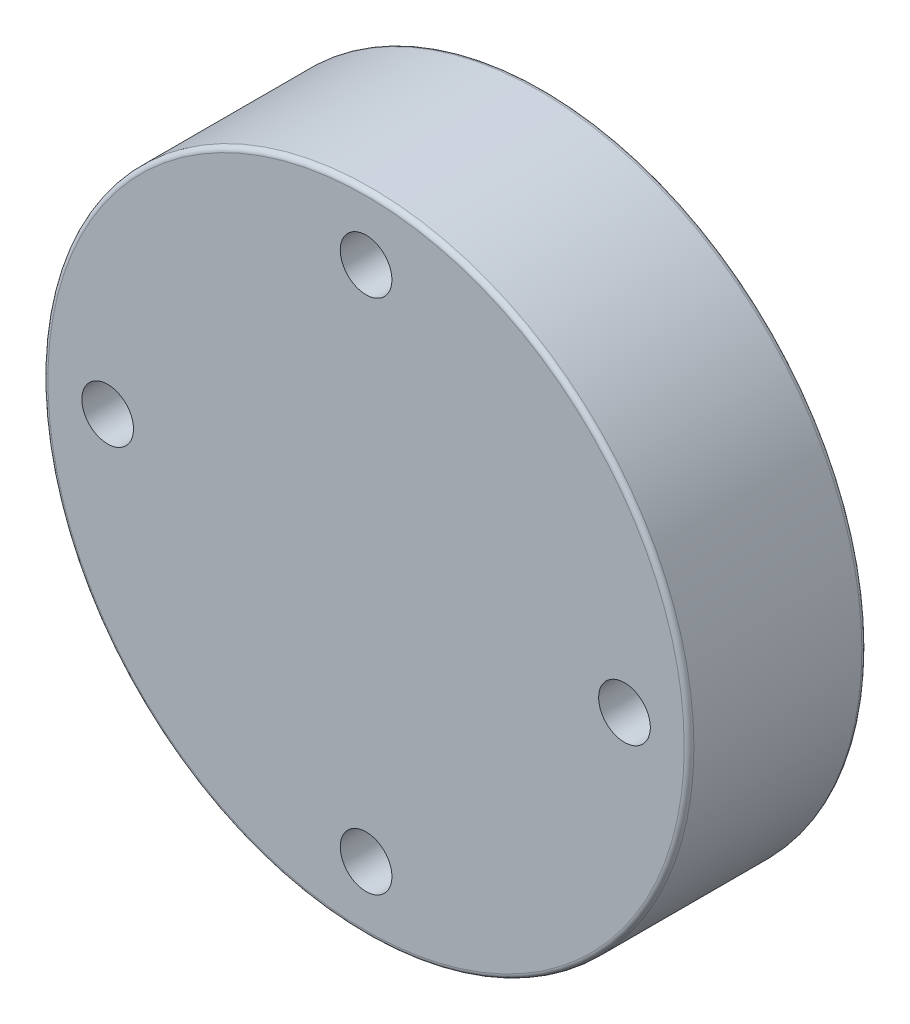
ISO-10303-21;
HEADER;
FILE_DESCRIPTION(('STEP AP214'),'2;1');
FILE_NAME('part.step','',(''),(''),'','','');
FILE_SCHEMA(('AUTOMOTIVE_DESIGN { 1 0 10303 214 1 1 1 1 }'));
ENDSEC;
DATA;
#1=APPLICATION_CONTEXT('core data for automotive mechanical design processes');
#2=APPLICATION_PROTOCOL_DEFINITION('international standard','automotive_design',2000,#1);
#3=PRODUCT_CONTEXT('',#1,'mechanical');
#4=PRODUCT('Part','Part','',(#3));
#5=PRODUCT_RELATED_PRODUCT_CATEGORY('part','',(#4));
#6=PRODUCT_DEFINITION_FORMATION('','',#4);
#7=PRODUCT_DEFINITION_CONTEXT('part definition',#1,'design');
#8=PRODUCT_DEFINITION('design','',#6,#7);
#9=PRODUCT_DEFINITION_SHAPE('','',#8);
#10=(LENGTH_UNIT() NAMED_UNIT(*) SI_UNIT(.MILLI.,.METRE.));
#11=(NAMED_UNIT(*) PLANE_ANGLE_UNIT() SI_UNIT($,.RADIAN.));
#12=(NAMED_UNIT(*) SI_UNIT($,.STERADIAN.) SOLID_ANGLE_UNIT());
#13=UNCERTAINTY_MEASURE_WITH_UNIT(LENGTH_MEASURE(1.E-05),#10,'distance_accuracy_value','');
#14=(GEOMETRIC_REPRESENTATION_CONTEXT(3) GLOBAL_UNCERTAINTY_ASSIGNED_CONTEXT((#13)) GLOBAL_UNIT_ASSIGNED_CONTEXT((#10,
#11,#12)) REPRESENTATION_CONTEXT('',''));
#15=CARTESIAN_POINT('',(0.,0.,0.));
#16=DIRECTION('',(0.,0.,1.));
#17=DIRECTION('',(1.,0.,0.));
#18=AXIS2_PLACEMENT_3D('',#15,#16,#17);
#19=CARTESIAN_POINT('',(0.,0.,10.));
#20=DIRECTION('',(0.,0.,-1.));
#21=DIRECTION('',(0.,-1.,0.));
#22=AXIS2_PLACEMENT_3D('',#19,#20,#21);
#23=PLANE('',#22);
#24=CARTESIAN_POINT('',(0.,0.,10.));
#25=DIRECTION('',(0.,0.,-1.));
#26=DIRECTION('',(-1.,0.,0.));
#27=AXIS2_PLACEMENT_3D('',#24,#25,#26);
#28=CIRCLE('',#27,12.);
#29=CARTESIAN_POINT('',(-12.,0.,10.));
#30=VERTEX_POINT('',#29);
#31=EDGE_CURVE('E126',#30,#30,#28,.T.);
#32=ORIENTED_EDGE('',*,*,#31,.T.);
#33=EDGE_LOOP('',(#32));
#34=FACE_BOUND('',#33,.T.);
#35=ADVANCED_FACE('F16',(#34),#23,.T.);
#36=CARTESIAN_POINT('',(0.,0.,-1.));
#37=DIRECTION('',(0.,0.,1.));
#38=DIRECTION('',(1.,0.,0.));
#39=AXIS2_PLACEMENT_3D('',#36,#37,#38);
#40=CONICAL_SURFACE('',#39,12.5,0.785398163397446);
#41=CARTESIAN_POINT('',(0.,0.,-1.));
#42=DIRECTION('',(0.,0.,-1.));
#43=DIRECTION('',(-1.,0.,0.));
#44=AXIS2_PLACEMENT_3D('',#41,#42,#43);
#45=CIRCLE('',#44,12.5);
#46=CARTESIAN_POINT('',(-12.5,0.,-1.));
#47=VERTEX_POINT('',#46);
#48=EDGE_CURVE('E11',#47,#47,#45,.T.);
#49=ORIENTED_EDGE('',*,*,#48,.F.);
#50=EDGE_LOOP('',(#49));
#51=FACE_BOUND('',#50,.T.);
#52=CARTESIAN_POINT('',(0.,0.,0.));
#53=DIRECTION('',(0.,0.,-1.));
#54=DIRECTION('',(-1.,0.,0.));
#55=AXIS2_PLACEMENT_3D('',#52,#53,#54);
#56=CIRCLE('',#55,13.5);
#57=CARTESIAN_POINT('',(-13.5,0.,0.));
#58=VERTEX_POINT('',#57);
#59=EDGE_CURVE('E82',#58,#58,#56,.T.);
#60=ORIENTED_EDGE('',*,*,#59,.T.);
#61=EDGE_LOOP('',(#60));
#62=FACE_BOUND('',#61,.T.);
#63=ADVANCED_FACE('F223',(#51,#62),#40,.T.);
#64=CARTESIAN_POINT('',(0.,0.,-1.));
#65=DIRECTION('',(0.,0.,-1.));
#66=DIRECTION('',(0.,-1.,0.));
#67=AXIS2_PLACEMENT_3D('',#64,#65,#66);
#68=PLANE('',#67);
#69=CARTESIAN_POINT('',(0.,0.,-1.));
#70=DIRECTION('',(0.,0.,-1.));
#71=DIRECTION('',(-1.,0.,0.));
#72=AXIS2_PLACEMENT_3D('',#69,#70,#71);
#73=CIRCLE('',#72,12.);
#74=CARTESIAN_POINT('',(-12.,0.,-1.));
#75=VERTEX_POINT('',#74);
#76=EDGE_CURVE('E27',#75,#75,#73,.T.);
#77=ORIENTED_EDGE('',*,*,#76,.F.);
#78=EDGE_LOOP('',(#77));
#79=FACE_BOUND('',#78,.T.);
#80=ORIENTED_EDGE('',*,*,#48,.T.);
#81=EDGE_LOOP('',(#80));
#82=FACE_BOUND('',#81,.T.);
#83=ADVANCED_FACE('F227',(#79,#82),#68,.T.);
#84=CARTESIAN_POINT('',(0.,0.,0.3));
#85=DIRECTION('',(0.,0.,1.));
#86=DIRECTION('',(1.,0.,0.));
#87=AXIS2_PLACEMENT_3D('',#84,#85,#86);
#88=TOROIDAL_SURFACE('',#87,19.7,0.3);
#89=CARTESIAN_POINT('',(0.,0.,0.3));
#90=DIRECTION('',(0.,0.,1.));
#91=DIRECTION('',(1.,0.,0.));
#92=AXIS2_PLACEMENT_3D('',#89,#90,#91);
#93=CIRCLE('',#92,20.);
#94=CARTESIAN_POINT('',(20.,0.,0.3));
#95=VERTEX_POINT('',#94);
#96=EDGE_CURVE('E144',#95,#95,#93,.T.);
#97=ORIENTED_EDGE('',*,*,#96,.F.);
#98=EDGE_LOOP('',(#97));
#99=FACE_BOUND('',#98,.T.);
#100=CARTESIAN_POINT('',(0.,0.,0.));
#101=DIRECTION('',(0.,0.,-1.));
#102=DIRECTION('',(1.,0.,0.));
#103=AXIS2_PLACEMENT_3D('',#100,#101,#102);
#104=CIRCLE('',#103,19.7);
#105=CARTESIAN_POINT('',(19.7,0.,0.));
#106=VERTEX_POINT('',#105);
#107=EDGE_CURVE('E89',#106,#106,#104,.T.);
#108=ORIENTED_EDGE('',*,*,#107,.F.);
#109=EDGE_LOOP('',(#108));
#110=FACE_BOUND('',#109,.T.);
#111=ADVANCED_FACE('F230',(#99,#110),#88,.T.);
#112=CARTESIAN_POINT('',(0.,0.,10.7));
#113=DIRECTION('',(0.,0.,1.));
#114=DIRECTION('',(1.,0.,0.));
#115=AXIS2_PLACEMENT_3D('',#112,#113,#114);
#116=TOROIDAL_SURFACE('',#115,19.7,0.3);
#117=CARTESIAN_POINT('',(0.,0.,11.));
#118=DIRECTION('',(0.,0.,1.));
#119=DIRECTION('',(1.,0.,0.));
#120=AXIS2_PLACEMENT_3D('',#117,#118,#119);
#121=CIRCLE('',#120,19.7);
#122=CARTESIAN_POINT('',(19.7,0.,11.));
#123=VERTEX_POINT('',#122);
#124=EDGE_CURVE('E130',#123,#123,#121,.T.);
#125=ORIENTED_EDGE('',*,*,#124,.F.);
#126=EDGE_LOOP('',(#125));
#127=FACE_BOUND('',#126,.T.);
#128=CARTESIAN_POINT('',(0.,0.,10.7));
#129=DIRECTION('',(0.,0.,-1.));
#130=DIRECTION('',(1.,0.,0.));
#131=AXIS2_PLACEMENT_3D('',#128,#129,#130);
#132=CIRCLE('',#131,20.);
#133=CARTESIAN_POINT('',(20.,0.,10.7));
#134=VERTEX_POINT('',#133);
#135=EDGE_CURVE('E147',#134,#134,#132,.T.);
#136=ORIENTED_EDGE('',*,*,#135,.F.);
#137=EDGE_LOOP('',(#136));
#138=FACE_BOUND('',#137,.T.);
#139=ADVANCED_FACE('F232',(#127,#138),#116,.T.);
#140=CARTESIAN_POINT('',(0.,16.,5.));
#141=DIRECTION('',(0.,0.,-1.));
#142=DIRECTION('',(-1.,0.,0.));
#143=AXIS2_PLACEMENT_3D('',#140,#141,#142);
#144=CYLINDRICAL_SURFACE('',#143,1.6);
#145=CARTESIAN_POINT('',(0.,16.,0.));
#146=DIRECTION('',(0.,0.,-1.));
#147=DIRECTION('',(-1.,0.,0.));
#148=AXIS2_PLACEMENT_3D('',#145,#146,#147);
#149=CIRCLE('',#148,1.6);
#150=CARTESIAN_POINT('',(-1.6,16.,0.));
#151=VERTEX_POINT('',#150);
#152=EDGE_CURVE('E108',#151,#151,#149,.T.);
#153=ORIENTED_EDGE('',*,*,#152,.T.);
#154=EDGE_LOOP('',(#153));
#155=FACE_BOUND('',#154,.T.);
#156=CARTESIAN_POINT('',(0.,16.,11.));
#157=DIRECTION('',(0.,0.,-1.));
#158=DIRECTION('',(-1.,0.,0.));
#159=AXIS2_PLACEMENT_3D('',#156,#157,#158);
#160=CIRCLE('',#159,1.6);
#161=CARTESIAN_POINT('',(-1.6,16.,11.));
#162=VERTEX_POINT('',#161);
#163=EDGE_CURVE('E127',#162,#162,#160,.T.);
#164=ORIENTED_EDGE('',*,*,#163,.F.);
#165=EDGE_LOOP('',(#164));
#166=FACE_BOUND('',#165,.T.);
#167=ADVANCED_FACE('F248',(#155,#166),#144,.F.);
#168=CARTESIAN_POINT('',(-16.,4.49068668875334E-13,5.));
#169=DIRECTION('',(0.,0.,-1.));
#170=DIRECTION('',(-1.,0.,0.));
#171=AXIS2_PLACEMENT_3D('',#168,#169,#170);
#172=CYLINDRICAL_SURFACE('',#171,1.60000000000048);
#173=CARTESIAN_POINT('',(-16.,4.49068668875334E-13,0.));
#174=DIRECTION('',(0.,0.,-1.));
#175=DIRECTION('',(-1.,0.,0.));
#176=AXIS2_PLACEMENT_3D('',#173,#174,#175);
#177=CIRCLE('',#176,1.60000000000048);
#178=CARTESIAN_POINT('',(-17.6000000000005,4.49068668875334E-13,0.));
#179=VERTEX_POINT('',#178);
#180=EDGE_CURVE('E102',#179,#179,#177,.T.);
#181=ORIENTED_EDGE('',*,*,#180,.T.);
#182=EDGE_LOOP('',(#181));
#183=FACE_BOUND('',#182,.T.);
#184=CARTESIAN_POINT('',(-16.,4.49068668875334E-13,11.));
#185=DIRECTION('',(0.,0.,-1.));
#186=DIRECTION('',(-1.,0.,0.));
#187=AXIS2_PLACEMENT_3D('',#184,#185,#186);
#188=CIRCLE('',#187,1.60000000000048);
#189=CARTESIAN_POINT('',(-17.6000000000005,4.49068668875334E-13,11.));
#190=VERTEX_POINT('',#189);
#191=EDGE_CURVE('E129',#190,#190,#188,.T.);
#192=ORIENTED_EDGE('',*,*,#191,.F.);
#193=EDGE_LOOP('',(#192));
#194=FACE_BOUND('',#193,.T.);
#195=ADVANCED_FACE('F103',(#183,#194),#172,.F.);
#196=CARTESIAN_POINT('',(-4.58483142604494E-13,-15.9999999999995,5.));
#197=DIRECTION('',(0.,0.,-1.));
#198=DIRECTION('',(-1.,0.,0.));
#199=AXIS2_PLACEMENT_3D('',#196,#197,#198);
#200=CYLINDRICAL_SURFACE('',#199,1.60000000000068);
#201=CARTESIAN_POINT('',(-4.58483142604494E-13,-15.9999999999995,0.));
#202=DIRECTION('',(0.,0.,-1.));
#203=DIRECTION('',(-1.,0.,0.));
#204=AXIS2_PLACEMENT_3D('',#201,#202,#203);
#205=CIRCLE('',#204,1.60000000000068);
#206=CARTESIAN_POINT('',(-1.60000000000114,-15.9999999999995,0.));
#207=VERTEX_POINT('',#206);
#208=EDGE_CURVE('E107',#207,#207,#205,.T.);
#209=ORIENTED_EDGE('',*,*,#208,.T.);
#210=EDGE_LOOP('',(#209));
#211=FACE_BOUND('',#210,.T.);
#212=CARTESIAN_POINT('',(-4.58483142604494E-13,-15.9999999999995,11.));
#213=DIRECTION('',(0.,0.,-1.));
#214=DIRECTION('',(-1.,0.,0.));
#215=AXIS2_PLACEMENT_3D('',#212,#213,#214);
#216=CIRCLE('',#215,1.60000000000068);
#217=CARTESIAN_POINT('',(-1.60000000000114,-15.9999999999995,11.));
#218=VERTEX_POINT('',#217);
#219=EDGE_CURVE('E142',#218,#218,#216,.T.);
#220=ORIENTED_EDGE('',*,*,#219,.F.);
#221=EDGE_LOOP('',(#220));
#222=FACE_BOUND('',#221,.T.);
#223=ADVANCED_FACE('F210',(#211,#222),#200,.F.);
#224=CARTESIAN_POINT('',(15.9999999999995,0.,5.));
#225=DIRECTION('',(0.,0.,-1.));
#226=DIRECTION('',(-1.,0.,0.));
#227=AXIS2_PLACEMENT_3D('',#224,#225,#226);
#228=CYLINDRICAL_SURFACE('',#227,1.60000000000029);
#229=CARTESIAN_POINT('',(15.9999999999995,0.,0.));
#230=DIRECTION('',(0.,0.,-1.));
#231=DIRECTION('',(-1.,0.,0.));
#232=AXIS2_PLACEMENT_3D('',#229,#230,#231);
#233=CIRCLE('',#232,1.60000000000029);
#234=CARTESIAN_POINT('',(14.3999999999993,0.,0.));
#235=VERTEX_POINT('',#234);
#236=EDGE_CURVE('E115',#235,#235,#233,.T.);
#237=ORIENTED_EDGE('',*,*,#236,.T.);
#238=EDGE_LOOP('',(#237));
#239=FACE_BOUND('',#238,.T.);
#240=CARTESIAN_POINT('',(15.9999999999995,0.,11.));
#241=DIRECTION('',(0.,0.,-1.));
#242=DIRECTION('',(-1.,0.,0.));
#243=AXIS2_PLACEMENT_3D('',#240,#241,#242);
#244=CIRCLE('',#243,1.60000000000029);
#245=CARTESIAN_POINT('',(14.3999999999993,0.,11.));
#246=VERTEX_POINT('',#245);
#247=EDGE_CURVE('E20',#246,#246,#244,.T.);
#248=ORIENTED_EDGE('',*,*,#247,.F.);
#249=EDGE_LOOP('',(#248));
#250=FACE_BOUND('',#249,.T.);
#251=ADVANCED_FACE('F207',(#239,#250),#228,.F.);
#252=CARTESIAN_POINT('',(0.,0.,5.));
#253=DIRECTION('',(0.,0.,-1.));
#254=DIRECTION('',(-1.,0.,0.));
#255=AXIS2_PLACEMENT_3D('',#252,#253,#254);
#256=CYLINDRICAL_SURFACE('',#255,12.);
#257=ORIENTED_EDGE('',*,*,#76,.T.);
#258=EDGE_LOOP('',(#257));
#259=FACE_BOUND('',#258,.T.);
#260=ORIENTED_EDGE('',*,*,#31,.F.);
#261=EDGE_LOOP('',(#260));
#262=FACE_BOUND('',#261,.T.);
#263=ADVANCED_FACE('F209',(#259,#262),#256,.F.);
#264=CARTESIAN_POINT('',(0.,0.,5.));
#265=DIRECTION('',(0.,0.,-1.));
#266=DIRECTION('',(-1.,0.,0.));
#267=AXIS2_PLACEMENT_3D('',#264,#265,#266);
#268=CYLINDRICAL_SURFACE('',#267,20.);
#269=ORIENTED_EDGE('',*,*,#96,.T.);
#270=EDGE_LOOP('',(#269));
#271=FACE_BOUND('',#270,.T.);
#272=ORIENTED_EDGE('',*,*,#135,.T.);
#273=EDGE_LOOP('',(#272));
#274=FACE_BOUND('',#273,.T.);
#275=ADVANCED_FACE('F18',(#271,#274),#268,.T.);
#276=CARTESIAN_POINT('',(0.,0.,0.));
#277=DIRECTION('',(0.,0.,1.));
#278=DIRECTION('',(1.,0.,0.));
#279=AXIS2_PLACEMENT_3D('',#276,#277,#278);
#280=PLANE('',#279);
#281=ORIENTED_EDGE('',*,*,#236,.F.);
#282=EDGE_LOOP('',(#281));
#283=FACE_BOUND('',#282,.T.);
#284=ORIENTED_EDGE('',*,*,#208,.F.);
#285=EDGE_LOOP('',(#284));
#286=FACE_BOUND('',#285,.T.);
#287=ORIENTED_EDGE('',*,*,#180,.F.);
#288=EDGE_LOOP('',(#287));
#289=FACE_BOUND('',#288,.T.);
#290=ORIENTED_EDGE('',*,*,#152,.F.);
#291=EDGE_LOOP('',(#290));
#292=FACE_BOUND('',#291,.T.);
#293=ORIENTED_EDGE('',*,*,#107,.T.);
#294=EDGE_LOOP('',(#293));
#295=FACE_BOUND('',#294,.T.);
#296=ORIENTED_EDGE('',*,*,#59,.F.);
#297=EDGE_LOOP('',(#296));
#298=FACE_BOUND('',#297,.T.);
#299=ADVANCED_FACE('F235',(#283,#286,#289,#292,#295,#298),#280,.F.);
#300=CARTESIAN_POINT('',(0.,0.,11.));
#301=DIRECTION('',(0.,0.,1.));
#302=DIRECTION('',(1.,0.,0.));
#303=AXIS2_PLACEMENT_3D('',#300,#301,#302);
#304=PLANE('',#303);
#305=ORIENTED_EDGE('',*,*,#247,.T.);
#306=EDGE_LOOP('',(#305));
#307=FACE_BOUND('',#306,.T.);
#308=ORIENTED_EDGE('',*,*,#219,.T.);
#309=EDGE_LOOP('',(#308));
#310=FACE_BOUND('',#309,.T.);
#311=ORIENTED_EDGE('',*,*,#191,.T.);
#312=EDGE_LOOP('',(#311));
#313=FACE_BOUND('',#312,.T.);
#314=ORIENTED_EDGE('',*,*,#163,.T.);
#315=EDGE_LOOP('',(#314));
#316=FACE_BOUND('',#315,.T.);
#317=ORIENTED_EDGE('',*,*,#124,.T.);
#318=EDGE_LOOP('',(#317));
#319=FACE_BOUND('',#318,.T.);
#320=ADVANCED_FACE('F205',(#307,#310,#313,#316,#319),#304,.T.);
#321=CLOSED_SHELL('',(#35,#63,#83,#111,#139,#167,#195,#223,#251,#263,#275,#299,#320));
#322=MANIFOLD_SOLID_BREP('B1',#321);
#323=ADVANCED_BREP_SHAPE_REPRESENTATION('',(#18,#322),#14);
#324=SHAPE_DEFINITION_REPRESENTATION(#9,#323);
ENDSEC;
END-ISO-10303-21;
